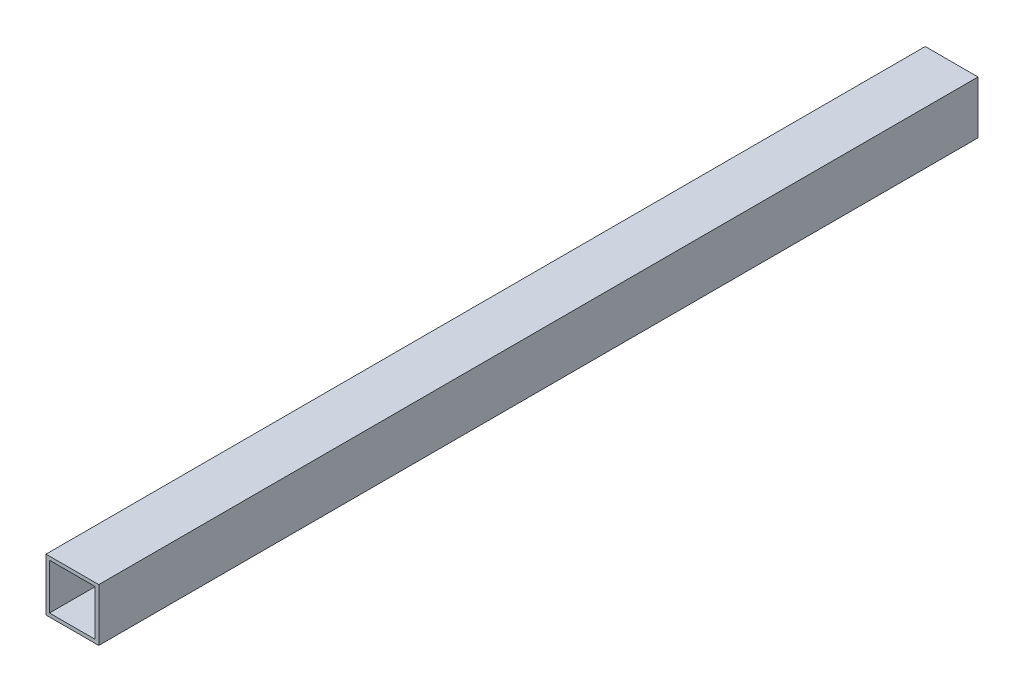
ISO-10303-21;
HEADER;
FILE_DESCRIPTION(('STEP AP214'),'2;1');
FILE_NAME('part.step','',(''),(''),'','','');
FILE_SCHEMA(('AUTOMOTIVE_DESIGN { 1 0 10303 214 1 1 1 1 }'));
ENDSEC;
DATA;
#1=APPLICATION_CONTEXT('core data for automotive mechanical design processes');
#2=APPLICATION_PROTOCOL_DEFINITION('international standard','automotive_design',2000,#1);
#3=PRODUCT_CONTEXT('',#1,'mechanical');
#4=PRODUCT('Part','Part','',(#3));
#5=PRODUCT_RELATED_PRODUCT_CATEGORY('part','',(#4));
#6=PRODUCT_DEFINITION_FORMATION('','',#4);
#7=PRODUCT_DEFINITION_CONTEXT('part definition',#1,'design');
#8=PRODUCT_DEFINITION('design','',#6,#7);
#9=PRODUCT_DEFINITION_SHAPE('','',#8);
#10=(LENGTH_UNIT() NAMED_UNIT(*) SI_UNIT(.MILLI.,.METRE.));
#11=(NAMED_UNIT(*) PLANE_ANGLE_UNIT() SI_UNIT($,.RADIAN.));
#12=(NAMED_UNIT(*) SI_UNIT($,.STERADIAN.) SOLID_ANGLE_UNIT());
#13=UNCERTAINTY_MEASURE_WITH_UNIT(LENGTH_MEASURE(1.E-05),#10,'distance_accuracy_value','');
#14=(GEOMETRIC_REPRESENTATION_CONTEXT(3) GLOBAL_UNCERTAINTY_ASSIGNED_CONTEXT((#13)) GLOBAL_UNIT_ASSIGNED_CONTEXT((#10,
#11,#12)) REPRESENTATION_CONTEXT('',''));
#15=CARTESIAN_POINT('',(0.,0.,0.));
#16=DIRECTION('',(0.,0.,1.));
#17=DIRECTION('',(1.,0.,0.));
#18=AXIS2_PLACEMENT_3D('',#15,#16,#17);
#19=CARTESIAN_POINT('',(-15.,-15.,500.));
#20=DIRECTION('',(0.,0.,1.));
#21=DIRECTION('',(1.,0.,0.));
#22=AXIS2_PLACEMENT_3D('',#19,#20,#21);
#23=PLANE('',#22);
#24=DIRECTION('',(0.,-1.,0.));
#25=VECTOR('',#24,1.);
#26=CARTESIAN_POINT('',(-15.,-15.,500.));
#27=LINE('',#26,#25);
#28=CARTESIAN_POINT('',(-15.,15.,500.));
#29=VERTEX_POINT('',#28);
#30=CARTESIAN_POINT('',(-15.,-15.,500.));
#31=VERTEX_POINT('',#30);
#32=EDGE_CURVE('E160',#29,#31,#27,.T.);
#33=ORIENTED_EDGE('',*,*,#32,.T.);
#34=DIRECTION('',(1.,0.,0.));
#35=VECTOR('',#34,1.);
#36=CARTESIAN_POINT('',(15.,-15.,500.));
#37=LINE('',#36,#35);
#38=CARTESIAN_POINT('',(15.,-15.,500.));
#39=VERTEX_POINT('',#38);
#40=EDGE_CURVE('E163',#31,#39,#37,.T.);
#41=ORIENTED_EDGE('',*,*,#40,.T.);
#42=DIRECTION('',(0.,1.,0.));
#43=VECTOR('',#42,1.);
#44=CARTESIAN_POINT('',(15.,-15.,500.));
#45=LINE('',#44,#43);
#46=CARTESIAN_POINT('',(15.,15.,500.));
#47=VERTEX_POINT('',#46);
#48=EDGE_CURVE('E166',#39,#47,#45,.T.);
#49=ORIENTED_EDGE('',*,*,#48,.T.);
#50=DIRECTION('',(-1.,0.,0.));
#51=VECTOR('',#50,1.);
#52=CARTESIAN_POINT('',(15.,15.,500.));
#53=LINE('',#52,#51);
#54=EDGE_CURVE('E168',#47,#29,#53,.T.);
#55=ORIENTED_EDGE('',*,*,#54,.T.);
#56=EDGE_LOOP('',(#33,#41,#49,#55));
#57=FACE_BOUND('',#56,.T.);
#58=DIRECTION('',(1.,0.,0.));
#59=VECTOR('',#58,1.);
#60=CARTESIAN_POINT('',(15.,-13.,500.));
#61=LINE('',#60,#59);
#62=CARTESIAN_POINT('',(-13.,-13.,500.));
#63=VERTEX_POINT('',#62);
#64=CARTESIAN_POINT('',(13.,-13.,500.));
#65=VERTEX_POINT('',#64);
#66=EDGE_CURVE('E132',#63,#65,#61,.T.);
#67=ORIENTED_EDGE('',*,*,#66,.F.);
#68=DIRECTION('',(0.,-1.,0.));
#69=VECTOR('',#68,1.);
#70=CARTESIAN_POINT('',(-13.,-15.,500.));
#71=LINE('',#70,#69);
#72=CARTESIAN_POINT('',(-13.,13.,500.));
#73=VERTEX_POINT('',#72);
#74=EDGE_CURVE('E124',#73,#63,#71,.T.);
#75=ORIENTED_EDGE('',*,*,#74,.F.);
#76=DIRECTION('',(-1.,0.,0.));
#77=VECTOR('',#76,1.);
#78=CARTESIAN_POINT('',(15.,13.,500.));
#79=LINE('',#78,#77);
#80=CARTESIAN_POINT('',(13.,13.,500.));
#81=VERTEX_POINT('',#80);
#82=EDGE_CURVE('E146',#81,#73,#79,.T.);
#83=ORIENTED_EDGE('',*,*,#82,.F.);
#84=DIRECTION('',(0.,1.,0.));
#85=VECTOR('',#84,1.);
#86=CARTESIAN_POINT('',(13.,-15.,500.));
#87=LINE('',#86,#85);
#88=EDGE_CURVE('E144',#65,#81,#87,.T.);
#89=ORIENTED_EDGE('',*,*,#88,.F.);
#90=EDGE_LOOP('',(#67,#75,#83,#89));
#91=FACE_BOUND('',#90,.T.);
#92=ADVANCED_FACE('F59',(#57,#91),#23,.T.);
#93=CARTESIAN_POINT('',(-15.,-15.,0.));
#94=DIRECTION('',(0.,0.,1.));
#95=DIRECTION('',(1.,0.,0.));
#96=AXIS2_PLACEMENT_3D('',#93,#94,#95);
#97=PLANE('',#96);
#98=DIRECTION('',(0.,-1.,0.));
#99=VECTOR('',#98,1.);
#100=CARTESIAN_POINT('',(-15.,-15.,0.));
#101=LINE('',#100,#99);
#102=CARTESIAN_POINT('',(-15.,15.,0.));
#103=VERTEX_POINT('',#102);
#104=CARTESIAN_POINT('',(-15.,-15.,0.));
#105=VERTEX_POINT('',#104);
#106=EDGE_CURVE('E140',#103,#105,#101,.T.);
#107=ORIENTED_EDGE('',*,*,#106,.F.);
#108=DIRECTION('',(-1.,0.,0.));
#109=VECTOR('',#108,1.);
#110=CARTESIAN_POINT('',(15.,15.,0.));
#111=LINE('',#110,#109);
#112=CARTESIAN_POINT('',(15.,15.,0.));
#113=VERTEX_POINT('',#112);
#114=EDGE_CURVE('E164',#113,#103,#111,.T.);
#115=ORIENTED_EDGE('',*,*,#114,.F.);
#116=DIRECTION('',(0.,1.,0.));
#117=VECTOR('',#116,1.);
#118=CARTESIAN_POINT('',(15.,-15.,0.));
#119=LINE('',#118,#117);
#120=CARTESIAN_POINT('',(15.,-15.,0.));
#121=VERTEX_POINT('',#120);
#122=EDGE_CURVE('E175',#121,#113,#119,.T.);
#123=ORIENTED_EDGE('',*,*,#122,.F.);
#124=DIRECTION('',(1.,0.,0.));
#125=VECTOR('',#124,1.);
#126=CARTESIAN_POINT('',(15.,-15.,0.));
#127=LINE('',#126,#125);
#128=EDGE_CURVE('E173',#105,#121,#127,.T.);
#129=ORIENTED_EDGE('',*,*,#128,.F.);
#130=EDGE_LOOP('',(#107,#115,#123,#129));
#131=FACE_BOUND('',#130,.T.);
#132=DIRECTION('',(0.,-1.,0.));
#133=VECTOR('',#132,1.);
#134=CARTESIAN_POINT('',(-13.,-15.,0.));
#135=LINE('',#134,#133);
#136=CARTESIAN_POINT('',(-13.,13.,0.));
#137=VERTEX_POINT('',#136);
#138=CARTESIAN_POINT('',(-13.,-13.,0.));
#139=VERTEX_POINT('',#138);
#140=EDGE_CURVE('E82',#137,#139,#135,.T.);
#141=ORIENTED_EDGE('',*,*,#140,.T.);
#142=DIRECTION('',(1.,0.,0.));
#143=VECTOR('',#142,1.);
#144=CARTESIAN_POINT('',(15.,-13.,0.));
#145=LINE('',#144,#143);
#146=CARTESIAN_POINT('',(13.,-13.,0.));
#147=VERTEX_POINT('',#146);
#148=EDGE_CURVE('E139',#139,#147,#145,.T.);
#149=ORIENTED_EDGE('',*,*,#148,.T.);
#150=DIRECTION('',(0.,1.,0.));
#151=VECTOR('',#150,1.);
#152=CARTESIAN_POINT('',(13.,-15.,0.));
#153=LINE('',#152,#151);
#154=CARTESIAN_POINT('',(13.,13.,0.));
#155=VERTEX_POINT('',#154);
#156=EDGE_CURVE('E152',#147,#155,#153,.T.);
#157=ORIENTED_EDGE('',*,*,#156,.T.);
#158=DIRECTION('',(-1.,0.,0.));
#159=VECTOR('',#158,1.);
#160=CARTESIAN_POINT('',(15.,13.,0.));
#161=LINE('',#160,#159);
#162=EDGE_CURVE('E133',#155,#137,#161,.T.);
#163=ORIENTED_EDGE('',*,*,#162,.T.);
#164=EDGE_LOOP('',(#141,#149,#157,#163));
#165=FACE_BOUND('',#164,.T.);
#166=ADVANCED_FACE('F193',(#131,#165),#97,.F.);
#167=CARTESIAN_POINT('',(-15.,-15.,500.));
#168=DIRECTION('',(1.,0.,0.));
#169=DIRECTION('',(0.,0.,-1.));
#170=AXIS2_PLACEMENT_3D('',#167,#168,#169);
#171=PLANE('',#170);
#172=ORIENTED_EDGE('',*,*,#106,.T.);
#173=DIRECTION('',(0.,0.,-1.));
#174=VECTOR('',#173,1.);
#175=CARTESIAN_POINT('',(-15.,-15.,500.));
#176=LINE('',#175,#174);
#177=EDGE_CURVE('E12',#31,#105,#176,.T.);
#178=ORIENTED_EDGE('',*,*,#177,.F.);
#179=ORIENTED_EDGE('',*,*,#32,.F.);
#180=DIRECTION('',(0.,0.,-1.));
#181=VECTOR('',#180,1.);
#182=CARTESIAN_POINT('',(-15.,15.,500.));
#183=LINE('',#182,#181);
#184=EDGE_CURVE('E170',#29,#103,#183,.T.);
#185=ORIENTED_EDGE('',*,*,#184,.T.);
#186=EDGE_LOOP('',(#172,#178,#179,#185));
#187=FACE_BOUND('',#186,.T.);
#188=ADVANCED_FACE('F61',(#187),#171,.F.);
#189=CARTESIAN_POINT('',(15.,-15.,500.));
#190=DIRECTION('',(0.,1.,0.));
#191=DIRECTION('',(-1.,0.,0.));
#192=AXIS2_PLACEMENT_3D('',#189,#190,#191);
#193=PLANE('',#192);
#194=ORIENTED_EDGE('',*,*,#128,.T.);
#195=DIRECTION('',(0.,0.,-1.));
#196=VECTOR('',#195,1.);
#197=CARTESIAN_POINT('',(15.,-15.,500.));
#198=LINE('',#197,#196);
#199=EDGE_CURVE('E67',#39,#121,#198,.T.);
#200=ORIENTED_EDGE('',*,*,#199,.F.);
#201=ORIENTED_EDGE('',*,*,#40,.F.);
#202=ORIENTED_EDGE('',*,*,#177,.T.);
#203=EDGE_LOOP('',(#194,#200,#201,#202));
#204=FACE_BOUND('',#203,.T.);
#205=ADVANCED_FACE('F203',(#204),#193,.F.);
#206=CARTESIAN_POINT('',(15.,-15.,500.));
#207=DIRECTION('',(-1.,0.,0.));
#208=DIRECTION('',(0.,0.,1.));
#209=AXIS2_PLACEMENT_3D('',#206,#207,#208);
#210=PLANE('',#209);
#211=ORIENTED_EDGE('',*,*,#122,.T.);
#212=DIRECTION('',(0.,0.,-1.));
#213=VECTOR('',#212,1.);
#214=CARTESIAN_POINT('',(15.,15.,500.));
#215=LINE('',#214,#213);
#216=EDGE_CURVE('E180',#47,#113,#215,.T.);
#217=ORIENTED_EDGE('',*,*,#216,.F.);
#218=ORIENTED_EDGE('',*,*,#48,.F.);
#219=ORIENTED_EDGE('',*,*,#199,.T.);
#220=EDGE_LOOP('',(#211,#217,#218,#219));
#221=FACE_BOUND('',#220,.T.);
#222=ADVANCED_FACE('F187',(#221),#210,.F.);
#223=CARTESIAN_POINT('',(15.,15.,500.));
#224=DIRECTION('',(0.,-1.,0.));
#225=DIRECTION('',(1.,0.,0.));
#226=AXIS2_PLACEMENT_3D('',#223,#224,#225);
#227=PLANE('',#226);
#228=ORIENTED_EDGE('',*,*,#114,.T.);
#229=ORIENTED_EDGE('',*,*,#184,.F.);
#230=ORIENTED_EDGE('',*,*,#54,.F.);
#231=ORIENTED_EDGE('',*,*,#216,.T.);
#232=EDGE_LOOP('',(#228,#229,#230,#231));
#233=FACE_BOUND('',#232,.T.);
#234=ADVANCED_FACE('F197',(#233),#227,.F.);
#235=CARTESIAN_POINT('',(-13.,-15.,500.));
#236=DIRECTION('',(1.,0.,0.));
#237=DIRECTION('',(0.,0.,-1.));
#238=AXIS2_PLACEMENT_3D('',#235,#236,#237);
#239=PLANE('',#238);
#240=ORIENTED_EDGE('',*,*,#140,.F.);
#241=DIRECTION('',(0.,0.,-1.));
#242=VECTOR('',#241,1.);
#243=CARTESIAN_POINT('',(-13.,13.,500.));
#244=LINE('',#243,#242);
#245=EDGE_CURVE('E128',#73,#137,#244,.T.);
#246=ORIENTED_EDGE('',*,*,#245,.F.);
#247=ORIENTED_EDGE('',*,*,#74,.T.);
#248=DIRECTION('',(0.,0.,-1.));
#249=VECTOR('',#248,1.);
#250=CARTESIAN_POINT('',(-13.,-13.,500.));
#251=LINE('',#250,#249);
#252=EDGE_CURVE('E127',#63,#139,#251,.T.);
#253=ORIENTED_EDGE('',*,*,#252,.T.);
#254=EDGE_LOOP('',(#240,#246,#247,#253));
#255=FACE_BOUND('',#254,.T.);
#256=ADVANCED_FACE('F126',(#255),#239,.T.);
#257=CARTESIAN_POINT('',(15.,-13.,500.));
#258=DIRECTION('',(0.,1.,0.));
#259=DIRECTION('',(-1.,0.,0.));
#260=AXIS2_PLACEMENT_3D('',#257,#258,#259);
#261=PLANE('',#260);
#262=ORIENTED_EDGE('',*,*,#148,.F.);
#263=ORIENTED_EDGE('',*,*,#252,.F.);
#264=ORIENTED_EDGE('',*,*,#66,.T.);
#265=DIRECTION('',(0.,0.,-1.));
#266=VECTOR('',#265,1.);
#267=CARTESIAN_POINT('',(13.,-13.,500.));
#268=LINE('',#267,#266);
#269=EDGE_CURVE('E141',#65,#147,#268,.T.);
#270=ORIENTED_EDGE('',*,*,#269,.T.);
#271=EDGE_LOOP('',(#262,#263,#264,#270));
#272=FACE_BOUND('',#271,.T.);
#273=ADVANCED_FACE('F136',(#272),#261,.T.);
#274=CARTESIAN_POINT('',(13.,-15.,500.));
#275=DIRECTION('',(-1.,0.,0.));
#276=DIRECTION('',(0.,0.,1.));
#277=AXIS2_PLACEMENT_3D('',#274,#275,#276);
#278=PLANE('',#277);
#279=ORIENTED_EDGE('',*,*,#156,.F.);
#280=ORIENTED_EDGE('',*,*,#269,.F.);
#281=ORIENTED_EDGE('',*,*,#88,.T.);
#282=DIRECTION('',(0.,0.,-1.));
#283=VECTOR('',#282,1.);
#284=CARTESIAN_POINT('',(13.,13.,500.));
#285=LINE('',#284,#283);
#286=EDGE_CURVE('E74',#81,#155,#285,.T.);
#287=ORIENTED_EDGE('',*,*,#286,.T.);
#288=EDGE_LOOP('',(#279,#280,#281,#287));
#289=FACE_BOUND('',#288,.T.);
#290=ADVANCED_FACE('F226',(#289),#278,.T.);
#291=CARTESIAN_POINT('',(15.,13.,500.));
#292=DIRECTION('',(0.,-1.,0.));
#293=DIRECTION('',(1.,0.,0.));
#294=AXIS2_PLACEMENT_3D('',#291,#292,#293);
#295=PLANE('',#294);
#296=ORIENTED_EDGE('',*,*,#162,.F.);
#297=ORIENTED_EDGE('',*,*,#286,.F.);
#298=ORIENTED_EDGE('',*,*,#82,.T.);
#299=ORIENTED_EDGE('',*,*,#245,.T.);
#300=EDGE_LOOP('',(#296,#297,#298,#299));
#301=FACE_BOUND('',#300,.T.);
#302=ADVANCED_FACE('F230',(#301),#295,.T.);
#303=CLOSED_SHELL('',(#92,#166,#188,#205,#222,#234,#256,#273,#290,#302));
#304=MANIFOLD_SOLID_BREP('B2',#303);
#305=ADVANCED_BREP_SHAPE_REPRESENTATION('',(#18,#304),#14);
#306=SHAPE_DEFINITION_REPRESENTATION(#9,#305);
ENDSEC;
END-ISO-10303-21;
